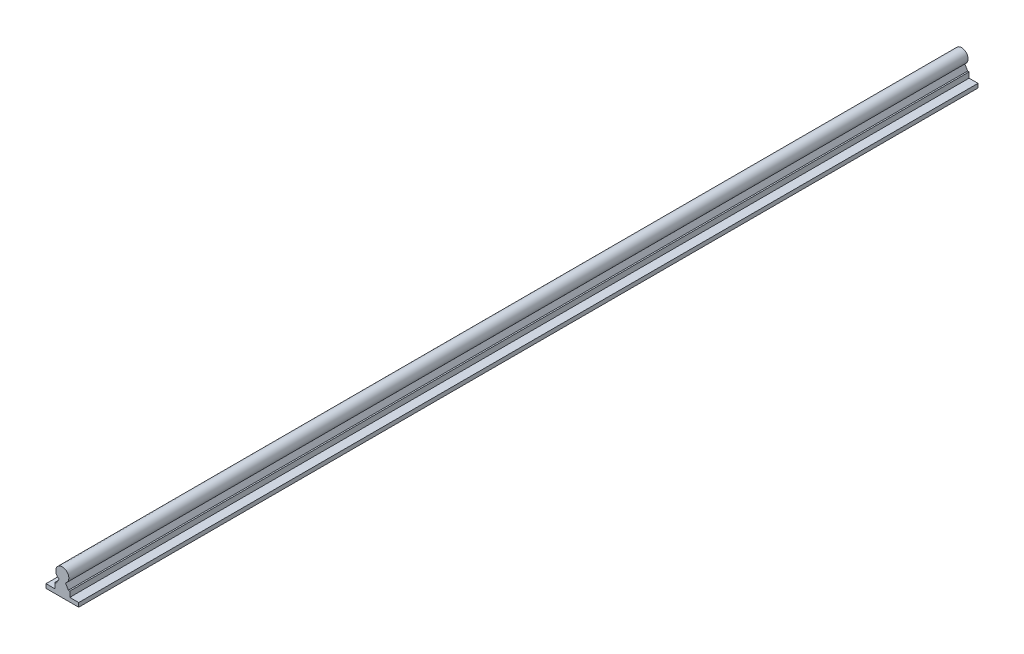
ISO-10303-21;
HEADER;
FILE_DESCRIPTION(('STEP AP214'),'2;1');
FILE_NAME('part.step','',(''),(''),'','','');
FILE_SCHEMA(('AUTOMOTIVE_DESIGN { 1 0 10303 214 1 1 1 1 }'));
ENDSEC;
DATA;
#1=APPLICATION_CONTEXT('core data for automotive mechanical design processes');
#2=APPLICATION_PROTOCOL_DEFINITION('international standard','automotive_design',2000,#1);
#3=PRODUCT_CONTEXT('',#1,'mechanical');
#4=PRODUCT('Part','Part','',(#3));
#5=PRODUCT_RELATED_PRODUCT_CATEGORY('part','',(#4));
#6=PRODUCT_DEFINITION_FORMATION('','',#4);
#7=PRODUCT_DEFINITION_CONTEXT('part definition',#1,'design');
#8=PRODUCT_DEFINITION('design','',#6,#7);
#9=PRODUCT_DEFINITION_SHAPE('','',#8);
#10=(LENGTH_UNIT() NAMED_UNIT(*) SI_UNIT(.MILLI.,.METRE.));
#11=(NAMED_UNIT(*) PLANE_ANGLE_UNIT() SI_UNIT($,.RADIAN.));
#12=(NAMED_UNIT(*) SI_UNIT($,.STERADIAN.) SOLID_ANGLE_UNIT());
#13=UNCERTAINTY_MEASURE_WITH_UNIT(LENGTH_MEASURE(1.E-05),#10,'distance_accuracy_value','');
#14=(GEOMETRIC_REPRESENTATION_CONTEXT(3) GLOBAL_UNCERTAINTY_ASSIGNED_CONTEXT((#13)) GLOBAL_UNIT_ASSIGNED_CONTEXT((#10,
#11,#12)) REPRESENTATION_CONTEXT('',''));
#15=CARTESIAN_POINT('',(0.,0.,0.));
#16=DIRECTION('',(0.,0.,1.));
#17=DIRECTION('',(1.,0.,0.));
#18=AXIS2_PLACEMENT_3D('',#15,#16,#17);
#19=CARTESIAN_POINT('',(-25.9312656727246,-7.76101992966002,1100.));
#20=DIRECTION('',(-1.,0.,0.));
#21=DIRECTION('',(0.,0.,1.));
#22=AXIS2_PLACEMENT_3D('',#19,#20,#21);
#23=PLANE('',#22);
#24=DIRECTION('',(0.,1.,0.));
#25=VECTOR('',#24,1.);
#26=CARTESIAN_POINT('',(-25.9312656727246,-7.76101992966002,0.));
#27=LINE('',#26,#25);
#28=CARTESIAN_POINT('',(-25.9312656727246,-7.76101992966002,0.));
#29=VERTEX_POINT('',#28);
#30=CARTESIAN_POINT('',(-25.9312656727246,-2.76101992966003,0.));
#31=VERTEX_POINT('',#30);
#32=EDGE_CURVE('E153',#29,#31,#27,.T.);
#33=ORIENTED_EDGE('',*,*,#32,.F.);
#34=DIRECTION('',(0.,0.,-1.));
#35=VECTOR('',#34,1.);
#36=CARTESIAN_POINT('',(-25.9312656727246,-7.76101992966002,1100.));
#37=LINE('',#36,#35);
#38=CARTESIAN_POINT('',(-25.9312656727246,-7.76101992966002,1100.));
#39=VERTEX_POINT('',#38);
#40=EDGE_CURVE('E11',#39,#29,#37,.T.);
#41=ORIENTED_EDGE('',*,*,#40,.F.);
#42=DIRECTION('',(0.,1.,0.));
#43=VECTOR('',#42,1.);
#44=CARTESIAN_POINT('',(-25.9312656727246,-7.76101992966002,1100.));
#45=LINE('',#44,#43);
#46=CARTESIAN_POINT('',(-25.9312656727246,-2.76101992966003,1100.));
#47=VERTEX_POINT('',#46);
#48=EDGE_CURVE('E185',#39,#47,#45,.T.);
#49=ORIENTED_EDGE('',*,*,#48,.T.);
#50=DIRECTION('',(0.,0.,-1.));
#51=VECTOR('',#50,1.);
#52=CARTESIAN_POINT('',(-25.9312656727246,-2.76101992966003,1100.));
#53=LINE('',#52,#51);
#54=EDGE_CURVE('E35',#47,#31,#53,.T.);
#55=ORIENTED_EDGE('',*,*,#54,.T.);
#56=EDGE_LOOP('',(#33,#41,#49,#55));
#57=FACE_BOUND('',#56,.T.);
#58=ADVANCED_FACE('F32',(#57),#23,.T.);
#59=CARTESIAN_POINT('',(14.0687343272754,-7.76101992966002,1100.));
#60=DIRECTION('',(0.,-1.,0.));
#61=DIRECTION('',(0.,0.,-1.));
#62=AXIS2_PLACEMENT_3D('',#59,#60,#61);
#63=PLANE('',#62);
#64=DIRECTION('',(-1.,0.,0.));
#65=VECTOR('',#64,1.);
#66=CARTESIAN_POINT('',(14.0687343272754,-7.76101992966002,0.));
#67=LINE('',#66,#65);
#68=CARTESIAN_POINT('',(14.0687343272754,-7.76101992966002,0.));
#69=VERTEX_POINT('',#68);
#70=EDGE_CURVE('E183',#69,#29,#67,.T.);
#71=ORIENTED_EDGE('',*,*,#70,.F.);
#72=DIRECTION('',(0.,0.,-1.));
#73=VECTOR('',#72,1.);
#74=CARTESIAN_POINT('',(14.0687343272754,-7.76101992966002,1100.));
#75=LINE('',#74,#73);
#76=CARTESIAN_POINT('',(14.0687343272754,-7.76101992966002,1100.));
#77=VERTEX_POINT('',#76);
#78=EDGE_CURVE('E41',#77,#69,#75,.T.);
#79=ORIENTED_EDGE('',*,*,#78,.F.);
#80=DIRECTION('',(-1.,0.,0.));
#81=VECTOR('',#80,1.);
#82=CARTESIAN_POINT('',(14.0687343272754,-7.76101992966002,1100.));
#83=LINE('',#82,#81);
#84=EDGE_CURVE('E143',#77,#39,#83,.T.);
#85=ORIENTED_EDGE('',*,*,#84,.T.);
#86=ORIENTED_EDGE('',*,*,#40,.T.);
#87=EDGE_LOOP('',(#71,#79,#85,#86));
#88=FACE_BOUND('',#87,.T.);
#89=ADVANCED_FACE('F205',(#88),#63,.T.);
#90=CARTESIAN_POINT('',(14.0687343272754,-2.76101992966002,1100.));
#91=DIRECTION('',(1.,0.,0.));
#92=DIRECTION('',(0.,0.,-1.));
#93=AXIS2_PLACEMENT_3D('',#90,#91,#92);
#94=PLANE('',#93);
#95=DIRECTION('',(0.,-1.,0.));
#96=VECTOR('',#95,1.);
#97=CARTESIAN_POINT('',(14.0687343272754,-2.76101992966002,0.));
#98=LINE('',#97,#96);
#99=CARTESIAN_POINT('',(14.0687343272754,-2.76101992966002,0.));
#100=VERTEX_POINT('',#99);
#101=EDGE_CURVE('E130',#100,#69,#98,.T.);
#102=ORIENTED_EDGE('',*,*,#101,.F.);
#103=DIRECTION('',(0.,0.,-1.));
#104=VECTOR('',#103,1.);
#105=CARTESIAN_POINT('',(14.0687343272754,-2.76101992966002,1100.));
#106=LINE('',#105,#104);
#107=CARTESIAN_POINT('',(14.0687343272754,-2.76101992966002,1100.));
#108=VERTEX_POINT('',#107);
#109=EDGE_CURVE('E125',#108,#100,#106,.T.);
#110=ORIENTED_EDGE('',*,*,#109,.F.);
#111=DIRECTION('',(0.,-1.,0.));
#112=VECTOR('',#111,1.);
#113=CARTESIAN_POINT('',(14.0687343272754,-2.76101992966002,1100.));
#114=LINE('',#113,#112);
#115=EDGE_CURVE('E128',#108,#77,#114,.T.);
#116=ORIENTED_EDGE('',*,*,#115,.T.);
#117=ORIENTED_EDGE('',*,*,#78,.T.);
#118=EDGE_LOOP('',(#102,#110,#116,#117));
#119=FACE_BOUND('',#118,.T.);
#120=ADVANCED_FACE('F127',(#119),#94,.T.);
#121=CARTESIAN_POINT('',(3.16040300380469,-2.76101992966,1100.));
#122=DIRECTION('',(0.,1.,0.));
#123=DIRECTION('',(-1.,0.,0.));
#124=AXIS2_PLACEMENT_3D('',#121,#122,#123);
#125=PLANE('',#124);
#126=DIRECTION('',(1.,0.,0.));
#127=VECTOR('',#126,1.);
#128=CARTESIAN_POINT('',(3.16040300380469,-2.76101992966,0.));
#129=LINE('',#128,#127);
#130=CARTESIAN_POINT('',(3.16040300380469,-2.76101992966,0.));
#131=VERTEX_POINT('',#130);
#132=EDGE_CURVE('E180',#131,#100,#129,.T.);
#133=ORIENTED_EDGE('',*,*,#132,.F.);
#134=DIRECTION('',(0.,0.,-1.));
#135=VECTOR('',#134,1.);
#136=CARTESIAN_POINT('',(3.16040300380469,-2.76101992966,1100.));
#137=LINE('',#136,#135);
#138=CARTESIAN_POINT('',(3.16040300380469,-2.76101992966,1100.));
#139=VERTEX_POINT('',#138);
#140=EDGE_CURVE('E135',#139,#131,#137,.T.);
#141=ORIENTED_EDGE('',*,*,#140,.F.);
#142=DIRECTION('',(1.,0.,0.));
#143=VECTOR('',#142,1.);
#144=CARTESIAN_POINT('',(3.16040300380469,-2.76101992966,1100.));
#145=LINE('',#144,#143);
#146=EDGE_CURVE('E141',#139,#108,#145,.T.);
#147=ORIENTED_EDGE('',*,*,#146,.T.);
#148=ORIENTED_EDGE('',*,*,#109,.T.);
#149=EDGE_LOOP('',(#133,#141,#147,#148));
#150=FACE_BOUND('',#149,.T.);
#151=ADVANCED_FACE('F145',(#150),#125,.T.);
#152=CARTESIAN_POINT('',(3.16040300380469,3.93898007033999,1100.));
#153=DIRECTION('',(1.,0.,0.));
#154=DIRECTION('',(0.,1.,0.));
#155=AXIS2_PLACEMENT_3D('',#152,#153,#154);
#156=PLANE('',#155);
#157=DIRECTION('',(0.,-1.,0.));
#158=VECTOR('',#157,1.);
#159=CARTESIAN_POINT('',(3.16040300380469,3.93898007033999,0.));
#160=LINE('',#159,#158);
#161=CARTESIAN_POINT('',(3.16040300380469,3.93898007033999,0.));
#162=VERTEX_POINT('',#161);
#163=EDGE_CURVE('E177',#162,#131,#160,.T.);
#164=ORIENTED_EDGE('',*,*,#163,.F.);
#165=DIRECTION('',(0.,0.,-1.));
#166=VECTOR('',#165,1.);
#167=CARTESIAN_POINT('',(3.16040300380469,3.93898007033999,1100.));
#168=LINE('',#167,#166);
#169=CARTESIAN_POINT('',(3.16040300380469,3.93898007033999,1100.));
#170=VERTEX_POINT('',#169);
#171=EDGE_CURVE('E189',#170,#162,#168,.T.);
#172=ORIENTED_EDGE('',*,*,#171,.F.);
#173=DIRECTION('',(0.,-1.,0.));
#174=VECTOR('',#173,1.);
#175=CARTESIAN_POINT('',(3.16040300380469,3.93898007033999,1100.));
#176=LINE('',#175,#174);
#177=EDGE_CURVE('E146',#170,#139,#176,.T.);
#178=ORIENTED_EDGE('',*,*,#177,.T.);
#179=ORIENTED_EDGE('',*,*,#140,.T.);
#180=EDGE_LOOP('',(#164,#172,#178,#179));
#181=FACE_BOUND('',#180,.T.);
#182=ADVANCED_FACE('F218',(#181),#156,.T.);
#183=CARTESIAN_POINT('',(1.43223964586137,3.93898007033999,1100.));
#184=DIRECTION('',(0.,1.,0.));
#185=DIRECTION('',(0.,0.,1.));
#186=AXIS2_PLACEMENT_3D('',#183,#184,#185);
#187=PLANE('',#186);
#188=DIRECTION('',(1.,0.,0.));
#189=VECTOR('',#188,1.);
#190=CARTESIAN_POINT('',(1.43223964586137,3.93898007033999,0.));
#191=LINE('',#190,#189);
#192=CARTESIAN_POINT('',(1.43223964586137,3.93898007033999,0.));
#193=VERTEX_POINT('',#192);
#194=EDGE_CURVE('E174',#193,#162,#191,.T.);
#195=ORIENTED_EDGE('',*,*,#194,.F.);
#196=DIRECTION('',(0.,0.,-1.));
#197=VECTOR('',#196,1.);
#198=CARTESIAN_POINT('',(1.43223964586137,3.93898007033999,1100.));
#199=LINE('',#198,#197);
#200=CARTESIAN_POINT('',(1.43223964586137,3.93898007033999,1100.));
#201=VERTEX_POINT('',#200);
#202=EDGE_CURVE('E191',#201,#193,#199,.T.);
#203=ORIENTED_EDGE('',*,*,#202,.F.);
#204=DIRECTION('',(1.,0.,0.));
#205=VECTOR('',#204,1.);
#206=CARTESIAN_POINT('',(1.43223964586137,3.93898007033999,1100.));
#207=LINE('',#206,#205);
#208=EDGE_CURVE('E148',#201,#170,#207,.T.);
#209=ORIENTED_EDGE('',*,*,#208,.T.);
#210=ORIENTED_EDGE('',*,*,#171,.T.);
#211=EDGE_LOOP('',(#195,#203,#209,#210));
#212=FACE_BOUND('',#211,.T.);
#213=ADVANCED_FACE('F221',(#212),#187,.T.);
#214=CARTESIAN_POINT('',(-2.08959699619534,10.03898007034,1100.));
#215=DIRECTION('',(0.866025403784439,0.5,0.));
#216=DIRECTION('',(-0.5,0.866025403784439,0.));
#217=AXIS2_PLACEMENT_3D('',#214,#215,#216);
#218=PLANE('',#217);
#219=DIRECTION('',(0.5,-0.866025403784439,0.));
#220=VECTOR('',#219,1.);
#221=CARTESIAN_POINT('',(-2.08959699619534,10.03898007034,0.));
#222=LINE('',#221,#220);
#223=CARTESIAN_POINT('',(-2.08959699619534,10.03898007034,0.));
#224=VERTEX_POINT('',#223);
#225=EDGE_CURVE('E171',#224,#193,#222,.T.);
#226=ORIENTED_EDGE('',*,*,#225,.F.);
#227=DIRECTION('',(0.,0.,-1.));
#228=VECTOR('',#227,1.);
#229=CARTESIAN_POINT('',(-2.08959699619534,10.03898007034,1100.));
#230=LINE('',#229,#228);
#231=CARTESIAN_POINT('',(-2.08959699619534,10.03898007034,1100.));
#232=VERTEX_POINT('',#231);
#233=EDGE_CURVE('E193',#232,#224,#230,.T.);
#234=ORIENTED_EDGE('',*,*,#233,.F.);
#235=DIRECTION('',(0.5,-0.866025403784439,0.));
#236=VECTOR('',#235,1.);
#237=CARTESIAN_POINT('',(-2.08959699619534,10.03898007034,1100.));
#238=LINE('',#237,#236);
#239=EDGE_CURVE('E347',#232,#201,#238,.T.);
#240=ORIENTED_EDGE('',*,*,#239,.T.);
#241=ORIENTED_EDGE('',*,*,#202,.T.);
#242=EDGE_LOOP('',(#226,#234,#240,#241));
#243=FACE_BOUND('',#242,.T.);
#244=ADVANCED_FACE('F225',(#243),#218,.T.);
#245=CARTESIAN_POINT('',(-6.01043133445998,17.012290481607,1100.));
#246=DIRECTION('',(0.,0.,-1.));
#247=DIRECTION('',(-1.,0.,0.));
#248=AXIS2_PLACEMENT_3D('',#245,#246,#247);
#249=CYLINDRICAL_SURFACE('',#248,8.);
#250=CARTESIAN_POINT('',(-6.01043133445998,17.012290481607,0.));
#251=DIRECTION('',(0.,0.,-1.));
#252=DIRECTION('',(-1.,0.,0.));
#253=AXIS2_PLACEMENT_3D('',#250,#251,#252);
#254=CIRCLE('',#253,8.);
#255=CARTESIAN_POINT('',(-9.93126567272462,10.03898007034,0.));
#256=VERTEX_POINT('',#255);
#257=EDGE_CURVE('E168',#256,#224,#254,.T.);
#258=ORIENTED_EDGE('',*,*,#257,.F.);
#259=DIRECTION('',(0.,0.,-1.));
#260=VECTOR('',#259,1.);
#261=CARTESIAN_POINT('',(-9.93126567272462,10.03898007034,1100.));
#262=LINE('',#261,#260);
#263=CARTESIAN_POINT('',(-9.93126567272462,10.03898007034,1100.));
#264=VERTEX_POINT('',#263);
#265=EDGE_CURVE('E195',#264,#256,#262,.T.);
#266=ORIENTED_EDGE('',*,*,#265,.F.);
#267=CARTESIAN_POINT('',(-6.01043133445998,17.012290481607,1100.));
#268=DIRECTION('',(0.,0.,-1.));
#269=DIRECTION('',(-1.,0.,0.));
#270=AXIS2_PLACEMENT_3D('',#267,#268,#269);
#271=CIRCLE('',#270,8.);
#272=EDGE_CURVE('E351',#264,#232,#271,.T.);
#273=ORIENTED_EDGE('',*,*,#272,.T.);
#274=ORIENTED_EDGE('',*,*,#233,.T.);
#275=EDGE_LOOP('',(#258,#266,#273,#274));
#276=FACE_BOUND('',#275,.T.);
#277=ADVANCED_FACE('F229',(#276),#249,.T.);
#278=CARTESIAN_POINT('',(-13.4531023147813,3.93898007033998,1100.));
#279=DIRECTION('',(-0.86602540378444,0.499999999999998,0.));
#280=DIRECTION('',(-0.499999999999998,-0.86602540378444,0.));
#281=AXIS2_PLACEMENT_3D('',#278,#279,#280);
#282=PLANE('',#281);
#283=DIRECTION('',(0.499999999999998,0.86602540378444,0.));
#284=VECTOR('',#283,1.);
#285=CARTESIAN_POINT('',(-13.4531023147813,3.93898007033998,0.));
#286=LINE('',#285,#284);
#287=CARTESIAN_POINT('',(-13.4531023147813,3.93898007033998,0.));
#288=VERTEX_POINT('',#287);
#289=EDGE_CURVE('E165',#288,#256,#286,.T.);
#290=ORIENTED_EDGE('',*,*,#289,.F.);
#291=DIRECTION('',(0.,0.,-1.));
#292=VECTOR('',#291,1.);
#293=CARTESIAN_POINT('',(-13.4531023147813,3.93898007033998,1100.));
#294=LINE('',#293,#292);
#295=CARTESIAN_POINT('',(-13.4531023147813,3.93898007033998,1100.));
#296=VERTEX_POINT('',#295);
#297=EDGE_CURVE('E197',#296,#288,#294,.T.);
#298=ORIENTED_EDGE('',*,*,#297,.F.);
#299=DIRECTION('',(0.499999999999998,0.86602540378444,0.));
#300=VECTOR('',#299,1.);
#301=CARTESIAN_POINT('',(-13.4531023147813,3.93898007033998,1100.));
#302=LINE('',#301,#300);
#303=EDGE_CURVE('E340',#296,#264,#302,.T.);
#304=ORIENTED_EDGE('',*,*,#303,.T.);
#305=ORIENTED_EDGE('',*,*,#265,.T.);
#306=EDGE_LOOP('',(#290,#298,#304,#305));
#307=FACE_BOUND('',#306,.T.);
#308=ADVANCED_FACE('F233',(#307),#282,.T.);
#309=CARTESIAN_POINT('',(-15.1812656727246,3.93898007033998,1100.));
#310=DIRECTION('',(0.,1.,0.));
#311=DIRECTION('',(-1.,0.,0.));
#312=AXIS2_PLACEMENT_3D('',#309,#310,#311);
#313=PLANE('',#312);
#314=DIRECTION('',(1.,0.,0.));
#315=VECTOR('',#314,1.);
#316=CARTESIAN_POINT('',(-15.1812656727246,3.93898007033998,0.));
#317=LINE('',#316,#315);
#318=CARTESIAN_POINT('',(-15.1812656727246,3.93898007033998,0.));
#319=VERTEX_POINT('',#318);
#320=EDGE_CURVE('E162',#319,#288,#317,.T.);
#321=ORIENTED_EDGE('',*,*,#320,.F.);
#322=DIRECTION('',(0.,0.,-1.));
#323=VECTOR('',#322,1.);
#324=CARTESIAN_POINT('',(-15.1812656727246,3.93898007033998,1100.));
#325=LINE('',#324,#323);
#326=CARTESIAN_POINT('',(-15.1812656727246,3.93898007033998,1100.));
#327=VERTEX_POINT('',#326);
#328=EDGE_CURVE('E199',#327,#319,#325,.T.);
#329=ORIENTED_EDGE('',*,*,#328,.F.);
#330=DIRECTION('',(1.,0.,0.));
#331=VECTOR('',#330,1.);
#332=CARTESIAN_POINT('',(-15.1812656727246,3.93898007033998,1100.));
#333=LINE('',#332,#331);
#334=EDGE_CURVE('E336',#327,#296,#333,.T.);
#335=ORIENTED_EDGE('',*,*,#334,.T.);
#336=ORIENTED_EDGE('',*,*,#297,.T.);
#337=EDGE_LOOP('',(#321,#329,#335,#336));
#338=FACE_BOUND('',#337,.T.);
#339=ADVANCED_FACE('F237',(#338),#313,.T.);
#340=CARTESIAN_POINT('',(-15.1812656727246,-2.76101992966002,1100.));
#341=DIRECTION('',(-1.,0.,0.));
#342=DIRECTION('',(0.,0.,1.));
#343=AXIS2_PLACEMENT_3D('',#340,#341,#342);
#344=PLANE('',#343);
#345=DIRECTION('',(0.,1.,0.));
#346=VECTOR('',#345,1.);
#347=CARTESIAN_POINT('',(-15.1812656727246,-2.76101992966002,0.));
#348=LINE('',#347,#346);
#349=CARTESIAN_POINT('',(-15.1812656727246,-2.76101992966002,0.));
#350=VERTEX_POINT('',#349);
#351=EDGE_CURVE('E159',#350,#319,#348,.T.);
#352=ORIENTED_EDGE('',*,*,#351,.F.);
#353=DIRECTION('',(0.,0.,-1.));
#354=VECTOR('',#353,1.);
#355=CARTESIAN_POINT('',(-15.1812656727246,-2.76101992966002,1100.));
#356=LINE('',#355,#354);
#357=CARTESIAN_POINT('',(-15.1812656727246,-2.76101992966002,1100.));
#358=VERTEX_POINT('',#357);
#359=EDGE_CURVE('E200',#358,#350,#356,.T.);
#360=ORIENTED_EDGE('',*,*,#359,.F.);
#361=DIRECTION('',(0.,1.,0.));
#362=VECTOR('',#361,1.);
#363=CARTESIAN_POINT('',(-15.1812656727246,-2.76101992966002,1100.));
#364=LINE('',#363,#362);
#365=EDGE_CURVE('E357',#358,#327,#364,.T.);
#366=ORIENTED_EDGE('',*,*,#365,.T.);
#367=ORIENTED_EDGE('',*,*,#328,.T.);
#368=EDGE_LOOP('',(#352,#360,#366,#367));
#369=FACE_BOUND('',#368,.T.);
#370=ADVANCED_FACE('F241',(#369),#344,.T.);
#371=CARTESIAN_POINT('',(-25.9312656727246,-2.76101992966003,1100.));
#372=DIRECTION('',(0.,1.,0.));
#373=DIRECTION('',(-1.,0.,0.));
#374=AXIS2_PLACEMENT_3D('',#371,#372,#373);
#375=PLANE('',#374);
#376=DIRECTION('',(1.,0.,0.));
#377=VECTOR('',#376,1.);
#378=CARTESIAN_POINT('',(-25.9312656727246,-2.76101992966003,0.));
#379=LINE('',#378,#377);
#380=EDGE_CURVE('E156',#31,#350,#379,.T.);
#381=ORIENTED_EDGE('',*,*,#380,.F.);
#382=ORIENTED_EDGE('',*,*,#54,.F.);
#383=DIRECTION('',(1.,0.,0.));
#384=VECTOR('',#383,1.);
#385=CARTESIAN_POINT('',(-25.9312656727246,-2.76101992966003,1100.));
#386=LINE('',#385,#384);
#387=EDGE_CURVE('E359',#47,#358,#386,.T.);
#388=ORIENTED_EDGE('',*,*,#387,.T.);
#389=ORIENTED_EDGE('',*,*,#359,.T.);
#390=EDGE_LOOP('',(#381,#382,#388,#389));
#391=FACE_BOUND('',#390,.T.);
#392=ADVANCED_FACE('F202',(#391),#375,.T.);
#393=CARTESIAN_POINT('',(-6.01043133445998,17.012290481607,1100.));
#394=DIRECTION('',(0.,0.,-1.));
#395=DIRECTION('',(-1.,0.,0.));
#396=AXIS2_PLACEMENT_3D('',#393,#394,#395);
#397=PLANE('',#396);
#398=ORIENTED_EDGE('',*,*,#48,.F.);
#399=ORIENTED_EDGE('',*,*,#84,.F.);
#400=ORIENTED_EDGE('',*,*,#115,.F.);
#401=ORIENTED_EDGE('',*,*,#146,.F.);
#402=ORIENTED_EDGE('',*,*,#177,.F.);
#403=ORIENTED_EDGE('',*,*,#208,.F.);
#404=ORIENTED_EDGE('',*,*,#239,.F.);
#405=ORIENTED_EDGE('',*,*,#272,.F.);
#406=ORIENTED_EDGE('',*,*,#303,.F.);
#407=ORIENTED_EDGE('',*,*,#334,.F.);
#408=ORIENTED_EDGE('',*,*,#365,.F.);
#409=ORIENTED_EDGE('',*,*,#387,.F.);
#410=EDGE_LOOP('',(#398,#399,#400,#401,#402,#403,#404,#405,#406,#407,#408,#409));
#411=FACE_BOUND('',#410,.T.);
#412=ADVANCED_FACE('F139',(#411),#397,.F.);
#413=CARTESIAN_POINT('',(-6.01043133445998,17.012290481607,0.));
#414=DIRECTION('',(0.,0.,-1.));
#415=DIRECTION('',(-1.,0.,0.));
#416=AXIS2_PLACEMENT_3D('',#413,#414,#415);
#417=PLANE('',#416);
#418=ORIENTED_EDGE('',*,*,#32,.T.);
#419=ORIENTED_EDGE('',*,*,#380,.T.);
#420=ORIENTED_EDGE('',*,*,#351,.T.);
#421=ORIENTED_EDGE('',*,*,#320,.T.);
#422=ORIENTED_EDGE('',*,*,#289,.T.);
#423=ORIENTED_EDGE('',*,*,#257,.T.);
#424=ORIENTED_EDGE('',*,*,#225,.T.);
#425=ORIENTED_EDGE('',*,*,#194,.T.);
#426=ORIENTED_EDGE('',*,*,#163,.T.);
#427=ORIENTED_EDGE('',*,*,#132,.T.);
#428=ORIENTED_EDGE('',*,*,#101,.T.);
#429=ORIENTED_EDGE('',*,*,#70,.T.);
#430=EDGE_LOOP('',(#418,#419,#420,#421,#422,#423,#424,#425,#426,#427,#428,#429));
#431=FACE_BOUND('',#430,.T.);
#432=ADVANCED_FACE('F204',(#431),#417,.T.);
#433=CLOSED_SHELL('',(#58,#89,#120,#151,#182,#213,#244,#277,#308,#339,#370,#392,#412,#432));
#434=MANIFOLD_SOLID_BREP('B2',#433);
#435=ADVANCED_BREP_SHAPE_REPRESENTATION('',(#18,#434),#14);
#436=SHAPE_DEFINITION_REPRESENTATION(#9,#435);
ENDSEC;
END-ISO-10303-21;
